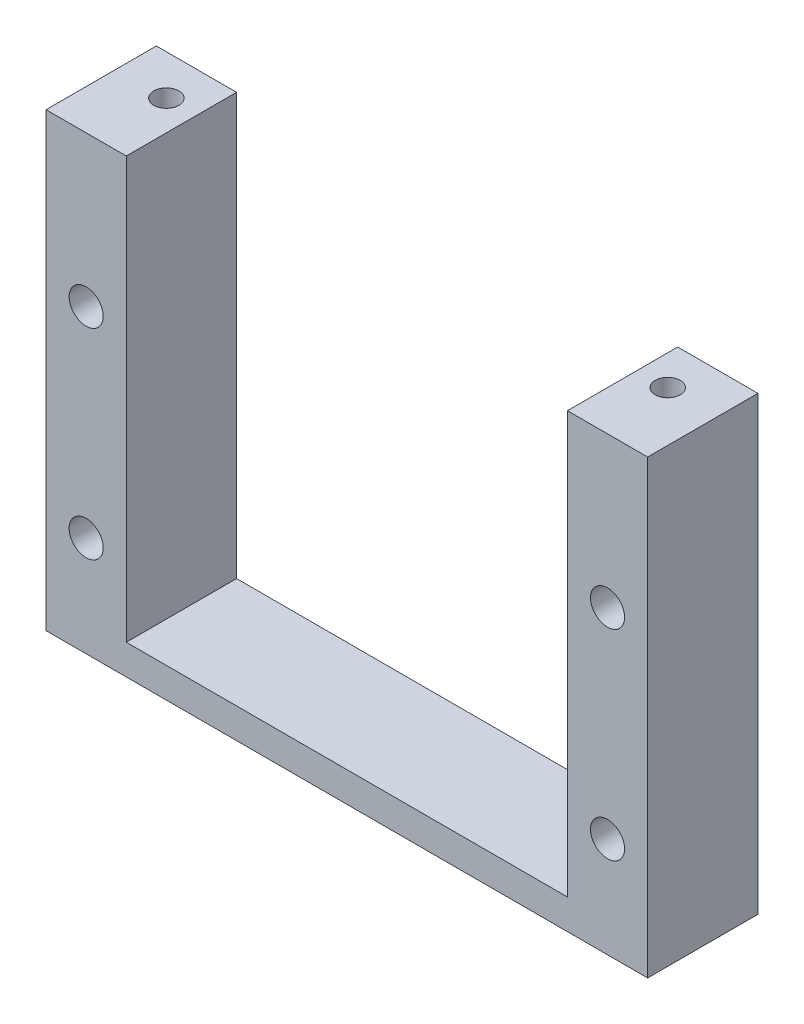
ISO-10303-21;
HEADER;
FILE_DESCRIPTION(('STEP AP214'),'2;1');
FILE_NAME('part.step','',(''),(''),'','','');
FILE_SCHEMA(('AUTOMOTIVE_DESIGN { 1 0 10303 214 1 1 1 1 }'));
ENDSEC;
DATA;
#1=APPLICATION_CONTEXT('core data for automotive mechanical design processes');
#2=APPLICATION_PROTOCOL_DEFINITION('international standard','automotive_design',2000,#1);
#3=PRODUCT_CONTEXT('',#1,'mechanical');
#4=PRODUCT('Part','Part','',(#3));
#5=PRODUCT_RELATED_PRODUCT_CATEGORY('part','',(#4));
#6=PRODUCT_DEFINITION_FORMATION('','',#4);
#7=PRODUCT_DEFINITION_CONTEXT('part definition',#1,'design');
#8=PRODUCT_DEFINITION('design','',#6,#7);
#9=PRODUCT_DEFINITION_SHAPE('','',#8);
#10=(LENGTH_UNIT() NAMED_UNIT(*) SI_UNIT(.MILLI.,.METRE.));
#11=(NAMED_UNIT(*) PLANE_ANGLE_UNIT() SI_UNIT($,.RADIAN.));
#12=(NAMED_UNIT(*) SI_UNIT($,.STERADIAN.) SOLID_ANGLE_UNIT());
#13=UNCERTAINTY_MEASURE_WITH_UNIT(LENGTH_MEASURE(1.E-05),#10,'distance_accuracy_value','');
#14=(GEOMETRIC_REPRESENTATION_CONTEXT(3) GLOBAL_UNCERTAINTY_ASSIGNED_CONTEXT((#13)) GLOBAL_UNIT_ASSIGNED_CONTEXT((#10,
#11,#12)) REPRESENTATION_CONTEXT('',''));
#15=CARTESIAN_POINT('',(0.,0.,0.));
#16=DIRECTION('',(0.,0.,1.));
#17=DIRECTION('',(1.,0.,0.));
#18=AXIS2_PLACEMENT_3D('',#15,#16,#17);
#19=CARTESIAN_POINT('',(0.,45.,11.));
#20=DIRECTION('',(0.,-1.,0.));
#21=DIRECTION('',(0.,0.,-1.));
#22=AXIS2_PLACEMENT_3D('',#19,#20,#21);
#23=PLANE('',#22);
#24=CARTESIAN_POINT('',(55.,45.,4.));
#25=DIRECTION('',(0.,1.,0.));
#26=DIRECTION('',(0.,0.,1.));
#27=AXIS2_PLACEMENT_3D('',#24,#25,#26);
#28=CIRCLE('',#27,1.25);
#29=CARTESIAN_POINT('',(55.,45.,5.25));
#30=VERTEX_POINT('',#29);
#31=EDGE_CURVE('E280',#30,#30,#28,.T.);
#32=ORIENTED_EDGE('',*,*,#31,.F.);
#33=EDGE_LOOP('',(#32));
#34=FACE_BOUND('',#33,.T.);
#35=DIRECTION('',(-1.,0.,0.));
#36=VECTOR('',#35,1.);
#37=CARTESIAN_POINT('',(0.,45.,0.));
#38=LINE('',#37,#36);
#39=CARTESIAN_POINT('',(60.,45.,0.));
#40=VERTEX_POINT('',#39);
#41=CARTESIAN_POINT('',(52.,45.,0.));
#42=VERTEX_POINT('',#41);
#43=EDGE_CURVE('E137',#40,#42,#38,.T.);
#44=ORIENTED_EDGE('',*,*,#43,.T.);
#45=DIRECTION('',(0.,0.,-1.));
#46=VECTOR('',#45,1.);
#47=CARTESIAN_POINT('',(52.,45.,0.));
#48=LINE('',#47,#46);
#49=CARTESIAN_POINT('',(52.,45.,11.));
#50=VERTEX_POINT('',#49);
#51=EDGE_CURVE('E125',#50,#42,#48,.T.);
#52=ORIENTED_EDGE('',*,*,#51,.F.);
#53=DIRECTION('',(-1.,0.,0.));
#54=VECTOR('',#53,1.);
#55=CARTESIAN_POINT('',(0.,45.,11.));
#56=LINE('',#55,#54);
#57=CARTESIAN_POINT('',(60.,45.,11.));
#58=VERTEX_POINT('',#57);
#59=EDGE_CURVE('E141',#58,#50,#56,.T.);
#60=ORIENTED_EDGE('',*,*,#59,.F.);
#61=DIRECTION('',(0.,0.,-1.));
#62=VECTOR('',#61,1.);
#63=CARTESIAN_POINT('',(60.,45.,11.));
#64=LINE('',#63,#62);
#65=EDGE_CURVE('E156',#58,#40,#64,.T.);
#66=ORIENTED_EDGE('',*,*,#65,.T.);
#67=EDGE_LOOP('',(#44,#52,#60,#66));
#68=FACE_BOUND('',#67,.T.);
#69=ADVANCED_FACE('F37',(#34,#68),#23,.F.);
#70=CARTESIAN_POINT('',(0.,0.,11.));
#71=DIRECTION('',(1.,0.,0.));
#72=DIRECTION('',(0.,1.,0.));
#73=AXIS2_PLACEMENT_3D('',#70,#71,#72);
#74=PLANE('',#73);
#75=DIRECTION('',(0.,-1.,0.));
#76=VECTOR('',#75,1.);
#77=CARTESIAN_POINT('',(0.,0.,0.));
#78=LINE('',#77,#76);
#79=CARTESIAN_POINT('',(0.,45.,0.));
#80=VERTEX_POINT('',#79);
#81=CARTESIAN_POINT('',(0.,0.,0.));
#82=VERTEX_POINT('',#81);
#83=EDGE_CURVE('E145',#80,#82,#78,.T.);
#84=ORIENTED_EDGE('',*,*,#83,.T.);
#85=DIRECTION('',(0.,0.,-1.));
#86=VECTOR('',#85,1.);
#87=CARTESIAN_POINT('',(0.,0.,11.));
#88=LINE('',#87,#86);
#89=CARTESIAN_POINT('',(0.,0.,11.));
#90=VERTEX_POINT('',#89);
#91=EDGE_CURVE('E11',#90,#82,#88,.T.);
#92=ORIENTED_EDGE('',*,*,#91,.F.);
#93=DIRECTION('',(0.,-1.,0.));
#94=VECTOR('',#93,1.);
#95=CARTESIAN_POINT('',(0.,0.,11.));
#96=LINE('',#95,#94);
#97=CARTESIAN_POINT('',(0.,45.,11.));
#98=VERTEX_POINT('',#97);
#99=EDGE_CURVE('E135',#98,#90,#96,.T.);
#100=ORIENTED_EDGE('',*,*,#99,.F.);
#101=DIRECTION('',(0.,0.,-1.));
#102=VECTOR('',#101,1.);
#103=CARTESIAN_POINT('',(0.,45.,11.));
#104=LINE('',#103,#102);
#105=EDGE_CURVE('E144',#98,#80,#104,.T.);
#106=ORIENTED_EDGE('',*,*,#105,.T.);
#107=EDGE_LOOP('',(#84,#92,#100,#106));
#108=FACE_BOUND('',#107,.T.);
#109=ADVANCED_FACE('F39',(#108),#74,.F.);
#110=CARTESIAN_POINT('',(0.,0.,11.));
#111=DIRECTION('',(0.,1.,0.));
#112=DIRECTION('',(0.,0.,1.));
#113=AXIS2_PLACEMENT_3D('',#110,#111,#112);
#114=PLANE('',#113);
#115=DIRECTION('',(1.,0.,0.));
#116=VECTOR('',#115,1.);
#117=CARTESIAN_POINT('',(0.,0.,0.));
#118=LINE('',#117,#116);
#119=CARTESIAN_POINT('',(60.,0.,0.));
#120=VERTEX_POINT('',#119);
#121=EDGE_CURVE('E148',#82,#120,#118,.T.);
#122=ORIENTED_EDGE('',*,*,#121,.T.);
#123=DIRECTION('',(0.,0.,-1.));
#124=VECTOR('',#123,1.);
#125=CARTESIAN_POINT('',(60.,0.,11.));
#126=LINE('',#125,#124);
#127=CARTESIAN_POINT('',(60.,0.,11.));
#128=VERTEX_POINT('',#127);
#129=EDGE_CURVE('E45',#128,#120,#126,.T.);
#130=ORIENTED_EDGE('',*,*,#129,.F.);
#131=DIRECTION('',(1.,0.,0.));
#132=VECTOR('',#131,1.);
#133=CARTESIAN_POINT('',(0.,0.,11.));
#134=LINE('',#133,#132);
#135=EDGE_CURVE('E90',#90,#128,#134,.T.);
#136=ORIENTED_EDGE('',*,*,#135,.F.);
#137=ORIENTED_EDGE('',*,*,#91,.T.);
#138=EDGE_LOOP('',(#122,#130,#136,#137));
#139=FACE_BOUND('',#138,.T.);
#140=ADVANCED_FACE('F173',(#139),#114,.F.);
#141=CARTESIAN_POINT('',(60.,0.,11.));
#142=DIRECTION('',(-1.,0.,0.));
#143=DIRECTION('',(0.,-1.,0.));
#144=AXIS2_PLACEMENT_3D('',#141,#142,#143);
#145=PLANE('',#144);
#146=DIRECTION('',(0.,1.,0.));
#147=VECTOR('',#146,1.);
#148=CARTESIAN_POINT('',(60.,0.,0.));
#149=LINE('',#148,#147);
#150=EDGE_CURVE('E151',#120,#40,#149,.T.);
#151=ORIENTED_EDGE('',*,*,#150,.T.);
#152=ORIENTED_EDGE('',*,*,#65,.F.);
#153=DIRECTION('',(0.,1.,0.));
#154=VECTOR('',#153,1.);
#155=CARTESIAN_POINT('',(60.,0.,11.));
#156=LINE('',#155,#154);
#157=EDGE_CURVE('E139',#128,#58,#156,.T.);
#158=ORIENTED_EDGE('',*,*,#157,.F.);
#159=ORIENTED_EDGE('',*,*,#129,.T.);
#160=EDGE_LOOP('',(#151,#152,#158,#159));
#161=FACE_BOUND('',#160,.T.);
#162=ADVANCED_FACE('F162',(#161),#145,.F.);
#163=CARTESIAN_POINT('',(5.,45.,4.));
#164=DIRECTION('',(0.,1.,0.));
#165=DIRECTION('',(0.,0.,1.));
#166=AXIS2_PLACEMENT_3D('',#163,#164,#165);
#167=CIRCLE('',#166,1.25);
#168=CARTESIAN_POINT('',(5.,45.,5.25));
#169=VERTEX_POINT('',#168);
#170=EDGE_CURVE('E197',#169,#169,#167,.T.);
#171=ORIENTED_EDGE('',*,*,#170,.F.);
#172=EDGE_LOOP('',(#171));
#173=FACE_BOUND('',#172,.T.);
#174=CARTESIAN_POINT('',(7.99999999999999,45.,11.));
#175=VERTEX_POINT('',#174);
#176=EDGE_CURVE('E61',#175,#98,#56,.T.);
#177=ORIENTED_EDGE('',*,*,#176,.F.);
#178=DIRECTION('',(0.,0.,1.));
#179=VECTOR('',#178,1.);
#180=CARTESIAN_POINT('',(7.99999999999999,45.,0.));
#181=LINE('',#180,#179);
#182=CARTESIAN_POINT('',(7.99999999999999,45.,0.));
#183=VERTEX_POINT('',#182);
#184=EDGE_CURVE('E198',#183,#175,#181,.T.);
#185=ORIENTED_EDGE('',*,*,#184,.F.);
#186=EDGE_CURVE('E83',#183,#80,#38,.T.);
#187=ORIENTED_EDGE('',*,*,#186,.T.);
#188=ORIENTED_EDGE('',*,*,#105,.F.);
#189=EDGE_LOOP('',(#177,#185,#187,#188));
#190=FACE_BOUND('',#189,.T.);
#191=ADVANCED_FACE('F179',(#173,#190),#23,.F.);
#192=CARTESIAN_POINT('',(0.,0.,11.));
#193=DIRECTION('',(0.,0.,-1.));
#194=DIRECTION('',(-1.,0.,0.));
#195=AXIS2_PLACEMENT_3D('',#192,#193,#194);
#196=PLANE('',#195);
#197=CARTESIAN_POINT('',(3.99999999999999,30.,11.));
#198=DIRECTION('',(0.,0.,-1.));
#199=DIRECTION('',(-1.,0.,0.));
#200=AXIS2_PLACEMENT_3D('',#197,#198,#199);
#201=CIRCLE('',#200,1.7);
#202=CARTESIAN_POINT('',(2.29999999999999,30.,11.));
#203=VERTEX_POINT('',#202);
#204=EDGE_CURVE('E255',#203,#203,#201,.T.);
#205=ORIENTED_EDGE('',*,*,#204,.T.);
#206=EDGE_LOOP('',(#205));
#207=FACE_BOUND('',#206,.T.);
#208=CARTESIAN_POINT('',(3.99999999999999,10.,11.));
#209=DIRECTION('',(0.,0.,-1.));
#210=DIRECTION('',(-1.,0.,0.));
#211=AXIS2_PLACEMENT_3D('',#208,#209,#210);
#212=CIRCLE('',#211,1.7);
#213=CARTESIAN_POINT('',(2.29999999999999,10.,11.));
#214=VERTEX_POINT('',#213);
#215=EDGE_CURVE('E265',#214,#214,#212,.T.);
#216=ORIENTED_EDGE('',*,*,#215,.T.);
#217=EDGE_LOOP('',(#216));
#218=FACE_BOUND('',#217,.T.);
#219=CARTESIAN_POINT('',(56.,10.,11.));
#220=DIRECTION('',(0.,0.,-1.));
#221=DIRECTION('',(-1.,0.,0.));
#222=AXIS2_PLACEMENT_3D('',#219,#220,#221);
#223=CIRCLE('',#222,1.7);
#224=CARTESIAN_POINT('',(54.3,10.,11.));
#225=VERTEX_POINT('',#224);
#226=EDGE_CURVE('E271',#225,#225,#223,.T.);
#227=ORIENTED_EDGE('',*,*,#226,.T.);
#228=EDGE_LOOP('',(#227));
#229=FACE_BOUND('',#228,.T.);
#230=CARTESIAN_POINT('',(56.,30.,11.));
#231=DIRECTION('',(0.,0.,-1.));
#232=DIRECTION('',(-1.,0.,0.));
#233=AXIS2_PLACEMENT_3D('',#230,#231,#232);
#234=CIRCLE('',#233,1.7);
#235=CARTESIAN_POINT('',(54.3,30.,11.));
#236=VERTEX_POINT('',#235);
#237=EDGE_CURVE('E277',#236,#236,#234,.T.);
#238=ORIENTED_EDGE('',*,*,#237,.T.);
#239=EDGE_LOOP('',(#238));
#240=FACE_BOUND('',#239,.T.);
#241=ORIENTED_EDGE('',*,*,#59,.T.);
#242=DIRECTION('',(0.,1.,0.));
#243=VECTOR('',#242,1.);
#244=CARTESIAN_POINT('',(52.,3.,11.));
#245=LINE('',#244,#243);
#246=CARTESIAN_POINT('',(52.,3.,11.));
#247=VERTEX_POINT('',#246);
#248=EDGE_CURVE('E130',#247,#50,#245,.T.);
#249=ORIENTED_EDGE('',*,*,#248,.F.);
#250=DIRECTION('',(1.,0.,0.));
#251=VECTOR('',#250,1.);
#252=CARTESIAN_POINT('',(7.99999999999999,3.,11.));
#253=LINE('',#252,#251);
#254=CARTESIAN_POINT('',(7.99999999999999,3.,11.));
#255=VERTEX_POINT('',#254);
#256=EDGE_CURVE('E118',#255,#247,#253,.T.);
#257=ORIENTED_EDGE('',*,*,#256,.F.);
#258=DIRECTION('',(0.,1.,0.));
#259=VECTOR('',#258,1.);
#260=CARTESIAN_POINT('',(7.99999999999999,3.,11.));
#261=LINE('',#260,#259);
#262=EDGE_CURVE('E116',#255,#175,#261,.T.);
#263=ORIENTED_EDGE('',*,*,#262,.T.);
#264=ORIENTED_EDGE('',*,*,#176,.T.);
#265=ORIENTED_EDGE('',*,*,#99,.T.);
#266=ORIENTED_EDGE('',*,*,#135,.T.);
#267=ORIENTED_EDGE('',*,*,#157,.T.);
#268=EDGE_LOOP('',(#241,#249,#257,#263,#264,#265,#266,#267));
#269=FACE_BOUND('',#268,.T.);
#270=ADVANCED_FACE('F169',(#207,#218,#229,#240,#269),#196,.F.);
#271=CARTESIAN_POINT('',(0.,0.,0.));
#272=DIRECTION('',(0.,0.,-1.));
#273=DIRECTION('',(-1.,0.,0.));
#274=AXIS2_PLACEMENT_3D('',#271,#272,#273);
#275=PLANE('',#274);
#276=CARTESIAN_POINT('',(3.99999999999999,30.,0.));
#277=DIRECTION('',(0.,0.,-1.));
#278=DIRECTION('',(-1.,0.,0.));
#279=AXIS2_PLACEMENT_3D('',#276,#277,#278);
#280=CIRCLE('',#279,1.69999999999999);
#281=CARTESIAN_POINT('',(2.3,30.,0.));
#282=VERTEX_POINT('',#281);
#283=EDGE_CURVE('E258',#282,#282,#280,.T.);
#284=ORIENTED_EDGE('',*,*,#283,.F.);
#285=EDGE_LOOP('',(#284));
#286=FACE_BOUND('',#285,.T.);
#287=CARTESIAN_POINT('',(3.99999999999999,10.,0.));
#288=DIRECTION('',(0.,0.,-1.));
#289=DIRECTION('',(-1.,0.,0.));
#290=AXIS2_PLACEMENT_3D('',#287,#288,#289);
#291=CIRCLE('',#290,1.69999999999999);
#292=CARTESIAN_POINT('',(2.3,10.,0.));
#293=VERTEX_POINT('',#292);
#294=EDGE_CURVE('E260',#293,#293,#291,.T.);
#295=ORIENTED_EDGE('',*,*,#294,.F.);
#296=EDGE_LOOP('',(#295));
#297=FACE_BOUND('',#296,.T.);
#298=CARTESIAN_POINT('',(56.,10.,0.));
#299=DIRECTION('',(0.,0.,-1.));
#300=DIRECTION('',(-1.,0.,0.));
#301=AXIS2_PLACEMENT_3D('',#298,#299,#300);
#302=CIRCLE('',#301,1.69999999999999);
#303=CARTESIAN_POINT('',(54.3,10.,0.));
#304=VERTEX_POINT('',#303);
#305=EDGE_CURVE('E268',#304,#304,#302,.T.);
#306=ORIENTED_EDGE('',*,*,#305,.F.);
#307=EDGE_LOOP('',(#306));
#308=FACE_BOUND('',#307,.T.);
#309=CARTESIAN_POINT('',(56.,30.,0.));
#310=DIRECTION('',(0.,0.,-1.));
#311=DIRECTION('',(-1.,0.,0.));
#312=AXIS2_PLACEMENT_3D('',#309,#310,#311);
#313=CIRCLE('',#312,1.69999999999999);
#314=CARTESIAN_POINT('',(54.3,30.,0.));
#315=VERTEX_POINT('',#314);
#316=EDGE_CURVE('E274',#315,#315,#313,.T.);
#317=ORIENTED_EDGE('',*,*,#316,.F.);
#318=EDGE_LOOP('',(#317));
#319=FACE_BOUND('',#318,.T.);
#320=DIRECTION('',(0.,1.,0.));
#321=VECTOR('',#320,1.);
#322=CARTESIAN_POINT('',(52.,3.,0.));
#323=LINE('',#322,#321);
#324=CARTESIAN_POINT('',(52.,3.,0.));
#325=VERTEX_POINT('',#324);
#326=EDGE_CURVE('E149',#325,#42,#323,.T.);
#327=ORIENTED_EDGE('',*,*,#326,.T.);
#328=ORIENTED_EDGE('',*,*,#43,.F.);
#329=ORIENTED_EDGE('',*,*,#150,.F.);
#330=ORIENTED_EDGE('',*,*,#121,.F.);
#331=ORIENTED_EDGE('',*,*,#83,.F.);
#332=ORIENTED_EDGE('',*,*,#186,.F.);
#333=DIRECTION('',(0.,1.,0.));
#334=VECTOR('',#333,1.);
#335=CARTESIAN_POINT('',(7.99999999999999,3.,0.));
#336=LINE('',#335,#334);
#337=CARTESIAN_POINT('',(7.99999999999999,3.,0.));
#338=VERTEX_POINT('',#337);
#339=EDGE_CURVE('E115',#338,#183,#336,.T.);
#340=ORIENTED_EDGE('',*,*,#339,.F.);
#341=DIRECTION('',(-1.,0.,0.));
#342=VECTOR('',#341,1.);
#343=CARTESIAN_POINT('',(7.99999999999999,3.,0.));
#344=LINE('',#343,#342);
#345=EDGE_CURVE('E119',#325,#338,#344,.T.);
#346=ORIENTED_EDGE('',*,*,#345,.F.);
#347=EDGE_LOOP('',(#327,#328,#329,#330,#331,#332,#340,#346));
#348=FACE_BOUND('',#347,.T.);
#349=ADVANCED_FACE('F127',(#286,#297,#308,#319,#348),#275,.T.);
#350=CARTESIAN_POINT('',(52.,3.,0.));
#351=DIRECTION('',(1.,0.,0.));
#352=DIRECTION('',(0.,0.,-1.));
#353=AXIS2_PLACEMENT_3D('',#350,#351,#352);
#354=PLANE('',#353);
#355=ORIENTED_EDGE('',*,*,#51,.T.);
#356=ORIENTED_EDGE('',*,*,#326,.F.);
#357=DIRECTION('',(0.,0.,-1.));
#358=VECTOR('',#357,1.);
#359=CARTESIAN_POINT('',(52.,3.,0.));
#360=LINE('',#359,#358);
#361=EDGE_CURVE('E52',#247,#325,#360,.T.);
#362=ORIENTED_EDGE('',*,*,#361,.F.);
#363=ORIENTED_EDGE('',*,*,#248,.T.);
#364=EDGE_LOOP('',(#355,#356,#362,#363));
#365=FACE_BOUND('',#364,.T.);
#366=ADVANCED_FACE('F207',(#365),#354,.F.);
#367=CARTESIAN_POINT('',(7.99999999999999,3.,0.));
#368=DIRECTION('',(-1.,0.,0.));
#369=DIRECTION('',(0.,0.,1.));
#370=AXIS2_PLACEMENT_3D('',#367,#368,#369);
#371=PLANE('',#370);
#372=ORIENTED_EDGE('',*,*,#184,.T.);
#373=ORIENTED_EDGE('',*,*,#262,.F.);
#374=DIRECTION('',(0.,0.,1.));
#375=VECTOR('',#374,1.);
#376=CARTESIAN_POINT('',(7.99999999999999,3.,0.));
#377=LINE('',#376,#375);
#378=EDGE_CURVE('E112',#338,#255,#377,.T.);
#379=ORIENTED_EDGE('',*,*,#378,.F.);
#380=ORIENTED_EDGE('',*,*,#339,.T.);
#381=EDGE_LOOP('',(#372,#373,#379,#380));
#382=FACE_BOUND('',#381,.T.);
#383=ADVANCED_FACE('F113',(#382),#371,.F.);
#384=CARTESIAN_POINT('',(0.,3.,0.));
#385=DIRECTION('',(0.,-1.,0.));
#386=DIRECTION('',(0.,0.,-1.));
#387=AXIS2_PLACEMENT_3D('',#384,#385,#386);
#388=PLANE('',#387);
#389=ORIENTED_EDGE('',*,*,#345,.T.);
#390=ORIENTED_EDGE('',*,*,#378,.T.);
#391=ORIENTED_EDGE('',*,*,#256,.T.);
#392=ORIENTED_EDGE('',*,*,#361,.T.);
#393=EDGE_LOOP('',(#389,#390,#391,#392));
#394=FACE_BOUND('',#393,.T.);
#395=ADVANCED_FACE('F122',(#394),#388,.F.);
#396=CARTESIAN_POINT('',(5.,35.,4.));
#397=DIRECTION('',(0.,1.,0.));
#398=DIRECTION('',(0.,0.,1.));
#399=AXIS2_PLACEMENT_3D('',#396,#397,#398);
#400=CYLINDRICAL_SURFACE('',#399,1.25);
#401=CARTESIAN_POINT('',(5.,35.,4.));
#402=DIRECTION('',(0.,1.,0.));
#403=DIRECTION('',(0.,0.,1.));
#404=AXIS2_PLACEMENT_3D('',#401,#402,#403);
#405=CIRCLE('',#404,1.25);
#406=CARTESIAN_POINT('',(5.,35.,5.25));
#407=VERTEX_POINT('',#406);
#408=EDGE_CURVE('E199',#407,#407,#405,.T.);
#409=ORIENTED_EDGE('',*,*,#408,.F.);
#410=EDGE_LOOP('',(#409));
#411=FACE_BOUND('',#410,.T.);
#412=ORIENTED_EDGE('',*,*,#170,.T.);
#413=EDGE_LOOP('',(#412));
#414=FACE_BOUND('',#413,.T.);
#415=ADVANCED_FACE('F219',(#411,#414),#400,.F.);
#416=CARTESIAN_POINT('',(5.,35.,4.));
#417=DIRECTION('',(0.,1.,0.));
#418=DIRECTION('',(0.,0.,1.));
#419=AXIS2_PLACEMENT_3D('',#416,#417,#418);
#420=PLANE('',#419);
#421=ORIENTED_EDGE('',*,*,#408,.T.);
#422=EDGE_LOOP('',(#421));
#423=FACE_BOUND('',#422,.T.);
#424=ADVANCED_FACE('F222',(#423),#420,.T.);
#425=CARTESIAN_POINT('',(55.,35.,4.));
#426=DIRECTION('',(0.,1.,0.));
#427=DIRECTION('',(0.,0.,1.));
#428=AXIS2_PLACEMENT_3D('',#425,#426,#427);
#429=CYLINDRICAL_SURFACE('',#428,1.25);
#430=CARTESIAN_POINT('',(55.,35.,4.));
#431=DIRECTION('',(0.,1.,0.));
#432=DIRECTION('',(0.,0.,1.));
#433=AXIS2_PLACEMENT_3D('',#430,#431,#432);
#434=CIRCLE('',#433,1.25);
#435=CARTESIAN_POINT('',(55.,35.,5.25));
#436=VERTEX_POINT('',#435);
#437=EDGE_CURVE('E281',#436,#436,#434,.T.);
#438=ORIENTED_EDGE('',*,*,#437,.F.);
#439=EDGE_LOOP('',(#438));
#440=FACE_BOUND('',#439,.T.);
#441=ORIENTED_EDGE('',*,*,#31,.T.);
#442=EDGE_LOOP('',(#441));
#443=FACE_BOUND('',#442,.T.);
#444=ADVANCED_FACE('F226',(#440,#443),#429,.F.);
#445=CARTESIAN_POINT('',(55.,35.,4.));
#446=DIRECTION('',(0.,1.,0.));
#447=DIRECTION('',(0.,0.,1.));
#448=AXIS2_PLACEMENT_3D('',#445,#446,#447);
#449=PLANE('',#448);
#450=ORIENTED_EDGE('',*,*,#437,.T.);
#451=EDGE_LOOP('',(#450));
#452=FACE_BOUND('',#451,.T.);
#453=ADVANCED_FACE('F230',(#452),#449,.T.);
#454=CARTESIAN_POINT('',(56.,30.,0.));
#455=DIRECTION('',(0.,0.,-1.));
#456=DIRECTION('',(-1.,0.,0.));
#457=AXIS2_PLACEMENT_3D('',#454,#455,#456);
#458=CYLINDRICAL_SURFACE('',#457,1.69999999999999);
#459=ORIENTED_EDGE('',*,*,#237,.F.);
#460=EDGE_LOOP('',(#459));
#461=FACE_BOUND('',#460,.T.);
#462=ORIENTED_EDGE('',*,*,#316,.T.);
#463=EDGE_LOOP('',(#462));
#464=FACE_BOUND('',#463,.T.);
#465=ADVANCED_FACE('F234',(#461,#464),#458,.F.);
#466=CARTESIAN_POINT('',(56.,10.,0.));
#467=DIRECTION('',(0.,0.,-1.));
#468=DIRECTION('',(-1.,0.,0.));
#469=AXIS2_PLACEMENT_3D('',#466,#467,#468);
#470=CYLINDRICAL_SURFACE('',#469,1.69999999999999);
#471=ORIENTED_EDGE('',*,*,#226,.F.);
#472=EDGE_LOOP('',(#471));
#473=FACE_BOUND('',#472,.T.);
#474=ORIENTED_EDGE('',*,*,#305,.T.);
#475=EDGE_LOOP('',(#474));
#476=FACE_BOUND('',#475,.T.);
#477=ADVANCED_FACE('F238',(#473,#476),#470,.F.);
#478=CARTESIAN_POINT('',(3.99999999999999,10.,0.));
#479=DIRECTION('',(0.,0.,-1.));
#480=DIRECTION('',(-1.,0.,0.));
#481=AXIS2_PLACEMENT_3D('',#478,#479,#480);
#482=CYLINDRICAL_SURFACE('',#481,1.69999999999999);
#483=ORIENTED_EDGE('',*,*,#215,.F.);
#484=EDGE_LOOP('',(#483));
#485=FACE_BOUND('',#484,.T.);
#486=ORIENTED_EDGE('',*,*,#294,.T.);
#487=EDGE_LOOP('',(#486));
#488=FACE_BOUND('',#487,.T.);
#489=ADVANCED_FACE('F242',(#485,#488),#482,.F.);
#490=CARTESIAN_POINT('',(3.99999999999999,30.,0.));
#491=DIRECTION('',(0.,0.,-1.));
#492=DIRECTION('',(-1.,0.,0.));
#493=AXIS2_PLACEMENT_3D('',#490,#491,#492);
#494=CYLINDRICAL_SURFACE('',#493,1.69999999999999);
#495=ORIENTED_EDGE('',*,*,#204,.F.);
#496=EDGE_LOOP('',(#495));
#497=FACE_BOUND('',#496,.T.);
#498=ORIENTED_EDGE('',*,*,#283,.T.);
#499=EDGE_LOOP('',(#498));
#500=FACE_BOUND('',#499,.T.);
#501=ADVANCED_FACE('F246',(#497,#500),#494,.F.);
#502=CLOSED_SHELL('',(#69,#109,#140,#162,#191,#270,#349,#366,#383,#395,#415,#424,#444,#453,#465,
#477,#489,#501));
#503=MANIFOLD_SOLID_BREP('B2',#502);
#504=ADVANCED_BREP_SHAPE_REPRESENTATION('',(#18,#503),#14);
#505=SHAPE_DEFINITION_REPRESENTATION(#9,#504);
ENDSEC;
END-ISO-10303-21;
